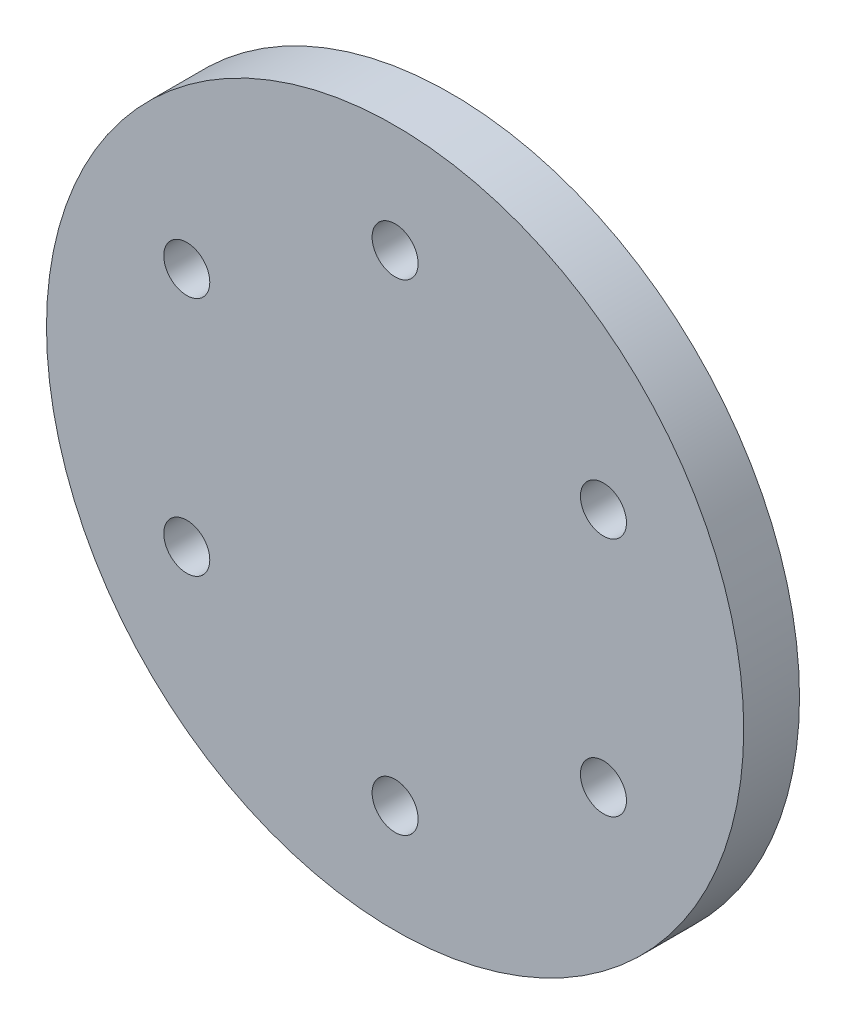
ISO-10303-21;
HEADER;
FILE_DESCRIPTION(('STEP AP214'),'2;1');
FILE_NAME('part.step','',(''),(''),'','','');
FILE_SCHEMA(('AUTOMOTIVE_DESIGN { 1 0 10303 214 1 1 1 1 }'));
ENDSEC;
DATA;
#1=APPLICATION_CONTEXT('core data for automotive mechanical design processes');
#2=APPLICATION_PROTOCOL_DEFINITION('international standard','automotive_design',2000,#1);
#3=PRODUCT_CONTEXT('',#1,'mechanical');
#4=PRODUCT('Part','Part','',(#3));
#5=PRODUCT_RELATED_PRODUCT_CATEGORY('part','',(#4));
#6=PRODUCT_DEFINITION_FORMATION('','',#4);
#7=PRODUCT_DEFINITION_CONTEXT('part definition',#1,'design');
#8=PRODUCT_DEFINITION('design','',#6,#7);
#9=PRODUCT_DEFINITION_SHAPE('','',#8);
#10=(LENGTH_UNIT() NAMED_UNIT(*) SI_UNIT(.MILLI.,.METRE.));
#11=(NAMED_UNIT(*) PLANE_ANGLE_UNIT() SI_UNIT($,.RADIAN.));
#12=(NAMED_UNIT(*) SI_UNIT($,.STERADIAN.) SOLID_ANGLE_UNIT());
#13=UNCERTAINTY_MEASURE_WITH_UNIT(LENGTH_MEASURE(1.E-05),#10,'distance_accuracy_value','');
#14=(GEOMETRIC_REPRESENTATION_CONTEXT(3) GLOBAL_UNCERTAINTY_ASSIGNED_CONTEXT((#13)) GLOBAL_UNIT_ASSIGNED_CONTEXT((#10,
#11,#12)) REPRESENTATION_CONTEXT('',''));
#15=CARTESIAN_POINT('',(0.,0.,0.));
#16=DIRECTION('',(0.,0.,1.));
#17=DIRECTION('',(1.,0.,0.));
#18=AXIS2_PLACEMENT_3D('',#15,#16,#17);
#19=CARTESIAN_POINT('',(0.,0.,4.));
#20=DIRECTION('',(0.,0.,1.));
#21=DIRECTION('',(1.,0.,0.));
#22=AXIS2_PLACEMENT_3D('',#19,#20,#21);
#23=PLANE('',#22);
#24=CARTESIAN_POINT('',(-14.9389382152805,-8.62500000000064,4.));
#25=DIRECTION('',(0.,0.,1.));
#26=DIRECTION('',(1.,0.,0.));
#27=AXIS2_PLACEMENT_3D('',#24,#25,#26);
#28=CIRCLE('',#27,1.65);
#29=CARTESIAN_POINT('',(-13.2889382152805,-8.62500000000064,4.));
#30=VERTEX_POINT('',#29);
#31=EDGE_CURVE('E72',#30,#30,#28,.T.);
#32=ORIENTED_EDGE('',*,*,#31,.F.);
#33=EDGE_LOOP('',(#32));
#34=FACE_BOUND('',#33,.T.);
#35=CARTESIAN_POINT('',(14.9389382152827,-8.62499999999937,4.));
#36=DIRECTION('',(0.,0.,1.));
#37=DIRECTION('',(1.,0.,0.));
#38=AXIS2_PLACEMENT_3D('',#35,#36,#37);
#39=CIRCLE('',#38,1.65);
#40=CARTESIAN_POINT('',(16.5889382152827,-8.62499999999937,4.));
#41=VERTEX_POINT('',#40);
#42=EDGE_CURVE('E60',#41,#41,#39,.T.);
#43=ORIENTED_EDGE('',*,*,#42,.F.);
#44=EDGE_LOOP('',(#43));
#45=FACE_BOUND('',#44,.T.);
#46=CARTESIAN_POINT('',(0.,17.25,4.));
#47=DIRECTION('',(0.,0.,1.));
#48=DIRECTION('',(1.,0.,0.));
#49=AXIS2_PLACEMENT_3D('',#46,#47,#48);
#50=CIRCLE('',#49,1.65);
#51=CARTESIAN_POINT('',(1.65,17.25,4.));
#52=VERTEX_POINT('',#51);
#53=EDGE_CURVE('E49',#52,#52,#50,.T.);
#54=ORIENTED_EDGE('',*,*,#53,.F.);
#55=EDGE_LOOP('',(#54));
#56=FACE_BOUND('',#55,.T.);
#57=CARTESIAN_POINT('',(0.,0.,4.));
#58=DIRECTION('',(0.,0.,1.));
#59=DIRECTION('',(1.,0.,0.));
#60=AXIS2_PLACEMENT_3D('',#57,#58,#59);
#61=CIRCLE('',#60,25.);
#62=CARTESIAN_POINT('',(25.,0.,4.));
#63=VERTEX_POINT('',#62);
#64=EDGE_CURVE('E10',#63,#63,#61,.T.);
#65=ORIENTED_EDGE('',*,*,#64,.T.);
#66=EDGE_LOOP('',(#65));
#67=FACE_BOUND('',#66,.T.);
#68=CARTESIAN_POINT('',(14.9389382152819,8.62500000000064,4.));
#69=DIRECTION('',(0.,0.,1.));
#70=DIRECTION('',(1.,0.,0.));
#71=AXIS2_PLACEMENT_3D('',#68,#69,#70);
#72=CIRCLE('',#71,1.65);
#73=CARTESIAN_POINT('',(16.5889382152819,8.62500000000064,4.));
#74=VERTEX_POINT('',#73);
#75=EDGE_CURVE('E54',#74,#74,#72,.T.);
#76=ORIENTED_EDGE('',*,*,#75,.F.);
#77=EDGE_LOOP('',(#76));
#78=FACE_BOUND('',#77,.T.);
#79=CARTESIAN_POINT('',(1.46448591583782E-12,-17.25,4.));
#80=DIRECTION('',(0.,0.,1.));
#81=DIRECTION('',(1.,0.,0.));
#82=AXIS2_PLACEMENT_3D('',#79,#80,#81);
#83=CIRCLE('',#82,1.65);
#84=CARTESIAN_POINT('',(1.65000000000146,-17.25,4.));
#85=VERTEX_POINT('',#84);
#86=EDGE_CURVE('E66',#85,#85,#83,.T.);
#87=ORIENTED_EDGE('',*,*,#86,.F.);
#88=EDGE_LOOP('',(#87));
#89=FACE_BOUND('',#88,.T.);
#90=CARTESIAN_POINT('',(-14.9389382152812,8.62499999999936,4.));
#91=DIRECTION('',(0.,0.,1.));
#92=DIRECTION('',(1.,0.,0.));
#93=AXIS2_PLACEMENT_3D('',#90,#91,#92);
#94=CIRCLE('',#93,1.65);
#95=CARTESIAN_POINT('',(-13.2889382152812,8.62499999999936,4.));
#96=VERTEX_POINT('',#95);
#97=EDGE_CURVE('E78',#96,#96,#94,.T.);
#98=ORIENTED_EDGE('',*,*,#97,.F.);
#99=EDGE_LOOP('',(#98));
#100=FACE_BOUND('',#99,.T.);
#101=ADVANCED_FACE('F38',(#34,#45,#56,#67,#78,#89,#100),#23,.T.);
#102=CARTESIAN_POINT('',(0.,0.,0.));
#103=DIRECTION('',(0.,0.,1.));
#104=DIRECTION('',(1.,0.,0.));
#105=AXIS2_PLACEMENT_3D('',#102,#103,#104);
#106=PLANE('',#105);
#107=CARTESIAN_POINT('',(0.,0.,0.));
#108=DIRECTION('',(0.,0.,1.));
#109=DIRECTION('',(1.,0.,0.));
#110=AXIS2_PLACEMENT_3D('',#107,#108,#109);
#111=CIRCLE('',#110,25.);
#112=CARTESIAN_POINT('',(25.,0.,0.));
#113=VERTEX_POINT('',#112);
#114=EDGE_CURVE('E42',#113,#113,#111,.T.);
#115=ORIENTED_EDGE('',*,*,#114,.F.);
#116=EDGE_LOOP('',(#115));
#117=FACE_BOUND('',#116,.T.);
#118=CARTESIAN_POINT('',(0.,17.25,0.));
#119=DIRECTION('',(0.,0.,1.));
#120=DIRECTION('',(1.,0.,0.));
#121=AXIS2_PLACEMENT_3D('',#118,#119,#120);
#122=CIRCLE('',#121,1.65);
#123=CARTESIAN_POINT('',(1.65,17.25,0.));
#124=VERTEX_POINT('',#123);
#125=EDGE_CURVE('E51',#124,#124,#122,.T.);
#126=ORIENTED_EDGE('',*,*,#125,.T.);
#127=EDGE_LOOP('',(#126));
#128=FACE_BOUND('',#127,.T.);
#129=CARTESIAN_POINT('',(14.9389382152819,8.62500000000064,0.));
#130=DIRECTION('',(0.,0.,1.));
#131=DIRECTION('',(1.,0.,0.));
#132=AXIS2_PLACEMENT_3D('',#129,#130,#131);
#133=CIRCLE('',#132,1.65);
#134=CARTESIAN_POINT('',(16.5889382152819,8.62500000000064,0.));
#135=VERTEX_POINT('',#134);
#136=EDGE_CURVE('E57',#135,#135,#133,.T.);
#137=ORIENTED_EDGE('',*,*,#136,.T.);
#138=EDGE_LOOP('',(#137));
#139=FACE_BOUND('',#138,.T.);
#140=CARTESIAN_POINT('',(14.9389382152827,-8.62499999999937,0.));
#141=DIRECTION('',(0.,0.,1.));
#142=DIRECTION('',(1.,0.,0.));
#143=AXIS2_PLACEMENT_3D('',#140,#141,#142);
#144=CIRCLE('',#143,1.65);
#145=CARTESIAN_POINT('',(16.5889382152827,-8.62499999999937,0.));
#146=VERTEX_POINT('',#145);
#147=EDGE_CURVE('E63',#146,#146,#144,.T.);
#148=ORIENTED_EDGE('',*,*,#147,.T.);
#149=EDGE_LOOP('',(#148));
#150=FACE_BOUND('',#149,.T.);
#151=CARTESIAN_POINT('',(1.46448591583782E-12,-17.25,0.));
#152=DIRECTION('',(0.,0.,1.));
#153=DIRECTION('',(1.,0.,0.));
#154=AXIS2_PLACEMENT_3D('',#151,#152,#153);
#155=CIRCLE('',#154,1.65);
#156=CARTESIAN_POINT('',(1.65000000000146,-17.25,0.));
#157=VERTEX_POINT('',#156);
#158=EDGE_CURVE('E69',#157,#157,#155,.T.);
#159=ORIENTED_EDGE('',*,*,#158,.T.);
#160=EDGE_LOOP('',(#159));
#161=FACE_BOUND('',#160,.T.);
#162=CARTESIAN_POINT('',(-14.9389382152805,-8.62500000000064,0.));
#163=DIRECTION('',(0.,0.,1.));
#164=DIRECTION('',(1.,0.,0.));
#165=AXIS2_PLACEMENT_3D('',#162,#163,#164);
#166=CIRCLE('',#165,1.65);
#167=CARTESIAN_POINT('',(-13.2889382152805,-8.62500000000064,0.));
#168=VERTEX_POINT('',#167);
#169=EDGE_CURVE('E75',#168,#168,#166,.T.);
#170=ORIENTED_EDGE('',*,*,#169,.T.);
#171=EDGE_LOOP('',(#170));
#172=FACE_BOUND('',#171,.T.);
#173=CARTESIAN_POINT('',(-14.9389382152812,8.62499999999936,0.));
#174=DIRECTION('',(0.,0.,1.));
#175=DIRECTION('',(1.,0.,0.));
#176=AXIS2_PLACEMENT_3D('',#173,#174,#175);
#177=CIRCLE('',#176,1.65);
#178=CARTESIAN_POINT('',(-13.2889382152812,8.62499999999936,0.));
#179=VERTEX_POINT('',#178);
#180=EDGE_CURVE('E81',#179,#179,#177,.T.);
#181=ORIENTED_EDGE('',*,*,#180,.T.);
#182=EDGE_LOOP('',(#181));
#183=FACE_BOUND('',#182,.T.);
#184=ADVANCED_FACE('F91',(#117,#128,#139,#150,#161,#172,#183),#106,.F.);
#185=CARTESIAN_POINT('',(0.,0.,4.));
#186=DIRECTION('',(0.,0.,-1.));
#187=DIRECTION('',(-1.,0.,0.));
#188=AXIS2_PLACEMENT_3D('',#185,#186,#187);
#189=CYLINDRICAL_SURFACE('',#188,25.);
#190=ORIENTED_EDGE('',*,*,#64,.F.);
#191=EDGE_LOOP('',(#190));
#192=FACE_BOUND('',#191,.T.);
#193=ORIENTED_EDGE('',*,*,#114,.T.);
#194=EDGE_LOOP('',(#193));
#195=FACE_BOUND('',#194,.T.);
#196=ADVANCED_FACE('F40',(#192,#195),#189,.T.);
#197=CARTESIAN_POINT('',(0.,17.25,4.));
#198=DIRECTION('',(0.,0.,-1.));
#199=DIRECTION('',(-1.,0.,0.));
#200=AXIS2_PLACEMENT_3D('',#197,#198,#199);
#201=CYLINDRICAL_SURFACE('',#200,1.65);
#202=ORIENTED_EDGE('',*,*,#53,.T.);
#203=EDGE_LOOP('',(#202));
#204=FACE_BOUND('',#203,.T.);
#205=ORIENTED_EDGE('',*,*,#125,.F.);
#206=EDGE_LOOP('',(#205));
#207=FACE_BOUND('',#206,.T.);
#208=ADVANCED_FACE('F101',(#204,#207),#201,.F.);
#209=CARTESIAN_POINT('',(14.9389382152819,8.62500000000064,4.));
#210=DIRECTION('',(0.,0.,-1.));
#211=DIRECTION('',(-1.,0.,0.));
#212=AXIS2_PLACEMENT_3D('',#209,#210,#211);
#213=CYLINDRICAL_SURFACE('',#212,1.65);
#214=ORIENTED_EDGE('',*,*,#75,.T.);
#215=EDGE_LOOP('',(#214));
#216=FACE_BOUND('',#215,.T.);
#217=ORIENTED_EDGE('',*,*,#136,.F.);
#218=EDGE_LOOP('',(#217));
#219=FACE_BOUND('',#218,.T.);
#220=ADVANCED_FACE('F104',(#216,#219),#213,.F.);
#221=CARTESIAN_POINT('',(14.9389382152827,-8.62499999999937,4.));
#222=DIRECTION('',(0.,0.,-1.));
#223=DIRECTION('',(-1.,0.,0.));
#224=AXIS2_PLACEMENT_3D('',#221,#222,#223);
#225=CYLINDRICAL_SURFACE('',#224,1.65);
#226=ORIENTED_EDGE('',*,*,#42,.T.);
#227=EDGE_LOOP('',(#226));
#228=FACE_BOUND('',#227,.T.);
#229=ORIENTED_EDGE('',*,*,#147,.F.);
#230=EDGE_LOOP('',(#229));
#231=FACE_BOUND('',#230,.T.);
#232=ADVANCED_FACE('F108',(#228,#231),#225,.F.);
#233=CARTESIAN_POINT('',(1.46448591583782E-12,-17.25,4.));
#234=DIRECTION('',(0.,0.,-1.));
#235=DIRECTION('',(-1.,0.,0.));
#236=AXIS2_PLACEMENT_3D('',#233,#234,#235);
#237=CYLINDRICAL_SURFACE('',#236,1.65);
#238=ORIENTED_EDGE('',*,*,#86,.T.);
#239=EDGE_LOOP('',(#238));
#240=FACE_BOUND('',#239,.T.);
#241=ORIENTED_EDGE('',*,*,#158,.F.);
#242=EDGE_LOOP('',(#241));
#243=FACE_BOUND('',#242,.T.);
#244=ADVANCED_FACE('F112',(#240,#243),#237,.F.);
#245=CARTESIAN_POINT('',(-14.9389382152805,-8.62500000000064,4.));
#246=DIRECTION('',(0.,0.,-1.));
#247=DIRECTION('',(-1.,0.,0.));
#248=AXIS2_PLACEMENT_3D('',#245,#246,#247);
#249=CYLINDRICAL_SURFACE('',#248,1.65);
#250=ORIENTED_EDGE('',*,*,#31,.T.);
#251=EDGE_LOOP('',(#250));
#252=FACE_BOUND('',#251,.T.);
#253=ORIENTED_EDGE('',*,*,#169,.F.);
#254=EDGE_LOOP('',(#253));
#255=FACE_BOUND('',#254,.T.);
#256=ADVANCED_FACE('F116',(#252,#255),#249,.F.);
#257=CARTESIAN_POINT('',(-14.9389382152812,8.62499999999936,4.));
#258=DIRECTION('',(0.,0.,-1.));
#259=DIRECTION('',(-1.,0.,0.));
#260=AXIS2_PLACEMENT_3D('',#257,#258,#259);
#261=CYLINDRICAL_SURFACE('',#260,1.65);
#262=ORIENTED_EDGE('',*,*,#97,.T.);
#263=EDGE_LOOP('',(#262));
#264=FACE_BOUND('',#263,.T.);
#265=ORIENTED_EDGE('',*,*,#180,.F.);
#266=EDGE_LOOP('',(#265));
#267=FACE_BOUND('',#266,.T.);
#268=ADVANCED_FACE('F87',(#264,#267),#261,.F.);
#269=CLOSED_SHELL('',(#101,#184,#196,#208,#220,#232,#244,#256,#268));
#270=MANIFOLD_SOLID_BREP('B2',#269);
#271=ADVANCED_BREP_SHAPE_REPRESENTATION('',(#18,#270),#14);
#272=SHAPE_DEFINITION_REPRESENTATION(#9,#271);
ENDSEC;
END-ISO-10303-21;
